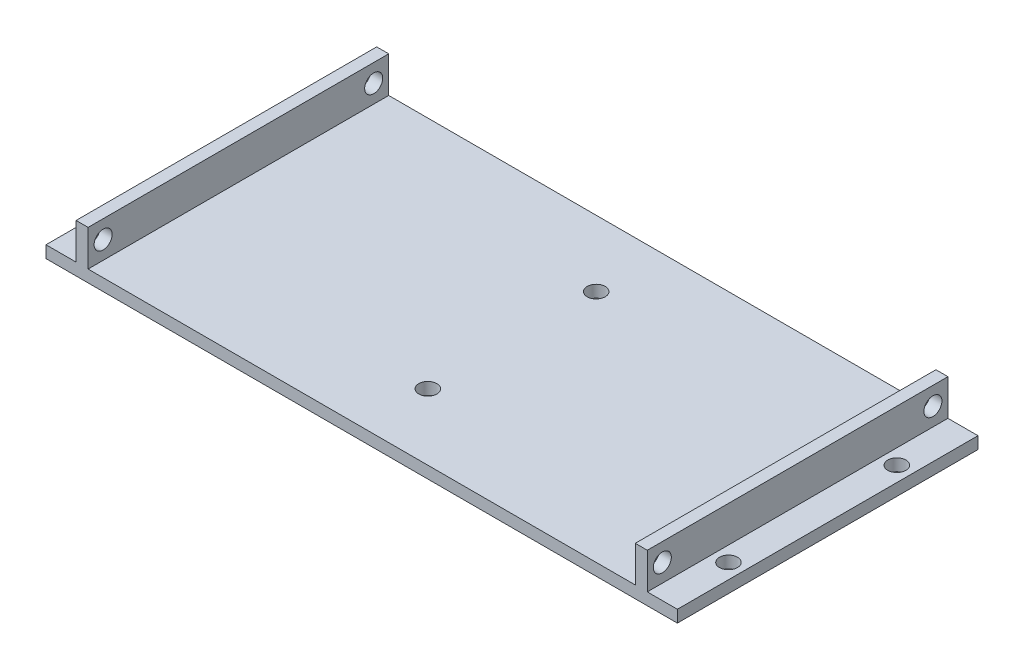
ISO-10303-21;
HEADER;
FILE_DESCRIPTION(('STEP AP214'),'2;1');
FILE_NAME('part.step','',(''),(''),'','','');
FILE_SCHEMA(('AUTOMOTIVE_DESIGN { 1 0 10303 214 1 1 1 1 }'));
ENDSEC;
DATA;
#1=APPLICATION_CONTEXT('core data for automotive mechanical design processes');
#2=APPLICATION_PROTOCOL_DEFINITION('international standard','automotive_design',2000,#1);
#3=PRODUCT_CONTEXT('',#1,'mechanical');
#4=PRODUCT('Part','Part','',(#3));
#5=PRODUCT_RELATED_PRODUCT_CATEGORY('part','',(#4));
#6=PRODUCT_DEFINITION_FORMATION('','',#4);
#7=PRODUCT_DEFINITION_CONTEXT('part definition',#1,'design');
#8=PRODUCT_DEFINITION('design','',#6,#7);
#9=PRODUCT_DEFINITION_SHAPE('','',#8);
#10=(LENGTH_UNIT() NAMED_UNIT(*) SI_UNIT(.MILLI.,.METRE.));
#11=(NAMED_UNIT(*) PLANE_ANGLE_UNIT() SI_UNIT($,.RADIAN.));
#12=(NAMED_UNIT(*) SI_UNIT($,.STERADIAN.) SOLID_ANGLE_UNIT());
#13=UNCERTAINTY_MEASURE_WITH_UNIT(LENGTH_MEASURE(1.E-05),#10,'distance_accuracy_value','');
#14=(GEOMETRIC_REPRESENTATION_CONTEXT(3) GLOBAL_UNCERTAINTY_ASSIGNED_CONTEXT((#13)) GLOBAL_UNIT_ASSIGNED_CONTEXT((#10,
#11,#12)) REPRESENTATION_CONTEXT('',''));
#15=CARTESIAN_POINT('',(0.,0.,0.));
#16=DIRECTION('',(0.,0.,1.));
#17=DIRECTION('',(1.,0.,0.));
#18=AXIS2_PLACEMENT_3D('',#15,#16,#17);
#19=CARTESIAN_POINT('',(0.,2.,0.));
#20=DIRECTION('',(0.,-1.,0.));
#21=DIRECTION('',(0.,0.,-1.));
#22=AXIS2_PLACEMENT_3D('',#19,#20,#21);
#23=PLANE('',#22);
#24=CARTESIAN_POINT('',(0.,2.,-14.));
#25=DIRECTION('',(0.,1.,0.));
#26=DIRECTION('',(0.,0.,1.));
#27=AXIS2_PLACEMENT_3D('',#24,#25,#26);
#28=CIRCLE('',#27,1.5);
#29=CARTESIAN_POINT('',(0.,2.,-12.5));
#30=VERTEX_POINT('',#29);
#31=EDGE_CURVE('E255',#30,#30,#28,.T.);
#32=ORIENTED_EDGE('',*,*,#31,.F.);
#33=EDGE_LOOP('',(#32));
#34=FACE_BOUND('',#33,.T.);
#35=CARTESIAN_POINT('',(0.,2.,14.));
#36=DIRECTION('',(0.,1.,0.));
#37=DIRECTION('',(0.,0.,1.));
#38=AXIS2_PLACEMENT_3D('',#35,#36,#37);
#39=CIRCLE('',#38,1.5);
#40=CARTESIAN_POINT('',(0.,2.,15.5));
#41=VERTEX_POINT('',#40);
#42=EDGE_CURVE('E252',#41,#41,#39,.T.);
#43=ORIENTED_EDGE('',*,*,#42,.F.);
#44=EDGE_LOOP('',(#43));
#45=FACE_BOUND('',#44,.T.);
#46=DIRECTION('',(0.,0.,1.));
#47=VECTOR('',#46,1.);
#48=CARTESIAN_POINT('',(45.5,2.,25.));
#49=LINE('',#48,#47);
#50=CARTESIAN_POINT('',(45.5,2.,-25.));
#51=VERTEX_POINT('',#50);
#52=CARTESIAN_POINT('',(45.5,2.,25.));
#53=VERTEX_POINT('',#52);
#54=EDGE_CURVE('E51',#51,#53,#49,.T.);
#55=ORIENTED_EDGE('',*,*,#54,.F.);
#56=DIRECTION('',(-1.,0.,0.));
#57=VECTOR('',#56,1.);
#58=CARTESIAN_POINT('',(-52.5,2.,-25.));
#59=LINE('',#58,#57);
#60=CARTESIAN_POINT('',(-45.5,2.,-25.));
#61=VERTEX_POINT('',#60);
#62=EDGE_CURVE('E188',#51,#61,#59,.T.);
#63=ORIENTED_EDGE('',*,*,#62,.T.);
#64=DIRECTION('',(0.,0.,-1.));
#65=VECTOR('',#64,1.);
#66=CARTESIAN_POINT('',(-45.5,2.,25.));
#67=LINE('',#66,#65);
#68=CARTESIAN_POINT('',(-45.5,2.,25.));
#69=VERTEX_POINT('',#68);
#70=EDGE_CURVE('E152',#69,#61,#67,.T.);
#71=ORIENTED_EDGE('',*,*,#70,.F.);
#72=DIRECTION('',(1.,0.,0.));
#73=VECTOR('',#72,1.);
#74=CARTESIAN_POINT('',(-52.5,2.,25.));
#75=LINE('',#74,#73);
#76=EDGE_CURVE('E194',#69,#53,#75,.T.);
#77=ORIENTED_EDGE('',*,*,#76,.T.);
#78=EDGE_LOOP('',(#55,#63,#71,#77));
#79=FACE_BOUND('',#78,.T.);
#80=ADVANCED_FACE('F34',(#34,#45,#79),#23,.F.);
#81=CARTESIAN_POINT('',(50.,2.,14.));
#82=DIRECTION('',(0.,1.,0.));
#83=DIRECTION('',(0.,0.,1.));
#84=AXIS2_PLACEMENT_3D('',#81,#82,#83);
#85=CIRCLE('',#84,1.5);
#86=CARTESIAN_POINT('',(50.,2.,15.5));
#87=VERTEX_POINT('',#86);
#88=EDGE_CURVE('E256',#87,#87,#85,.T.);
#89=ORIENTED_EDGE('',*,*,#88,.F.);
#90=EDGE_LOOP('',(#89));
#91=FACE_BOUND('',#90,.T.);
#92=CARTESIAN_POINT('',(50.,2.,-14.));
#93=DIRECTION('',(0.,1.,0.));
#94=DIRECTION('',(0.,0.,1.));
#95=AXIS2_PLACEMENT_3D('',#92,#93,#94);
#96=CIRCLE('',#95,1.5);
#97=CARTESIAN_POINT('',(50.,2.,-12.5));
#98=VERTEX_POINT('',#97);
#99=EDGE_CURVE('E259',#98,#98,#96,.T.);
#100=ORIENTED_EDGE('',*,*,#99,.F.);
#101=EDGE_LOOP('',(#100));
#102=FACE_BOUND('',#101,.T.);
#103=DIRECTION('',(0.,0.,-1.));
#104=VECTOR('',#103,1.);
#105=CARTESIAN_POINT('',(47.5,2.,25.));
#106=LINE('',#105,#104);
#107=CARTESIAN_POINT('',(47.5,2.,25.));
#108=VERTEX_POINT('',#107);
#109=CARTESIAN_POINT('',(47.5,2.,-25.));
#110=VERTEX_POINT('',#109);
#111=EDGE_CURVE('E146',#108,#110,#106,.T.);
#112=ORIENTED_EDGE('',*,*,#111,.F.);
#113=CARTESIAN_POINT('',(52.5,2.,25.));
#114=VERTEX_POINT('',#113);
#115=EDGE_CURVE('E190',#108,#114,#75,.T.);
#116=ORIENTED_EDGE('',*,*,#115,.T.);
#117=DIRECTION('',(0.,0.,-1.));
#118=VECTOR('',#117,1.);
#119=CARTESIAN_POINT('',(52.5,2.,25.));
#120=LINE('',#119,#118);
#121=CARTESIAN_POINT('',(52.5,2.,-25.));
#122=VERTEX_POINT('',#121);
#123=EDGE_CURVE('E182',#114,#122,#120,.T.);
#124=ORIENTED_EDGE('',*,*,#123,.T.);
#125=EDGE_CURVE('E59',#122,#110,#59,.T.);
#126=ORIENTED_EDGE('',*,*,#125,.T.);
#127=EDGE_LOOP('',(#112,#116,#124,#126));
#128=FACE_BOUND('',#127,.T.);
#129=ADVANCED_FACE('F280',(#91,#102,#128),#23,.F.);
#130=CARTESIAN_POINT('',(-50.,2.,14.));
#131=DIRECTION('',(0.,1.,0.));
#132=DIRECTION('',(0.,0.,1.));
#133=AXIS2_PLACEMENT_3D('',#130,#131,#132);
#134=CIRCLE('',#133,1.5);
#135=CARTESIAN_POINT('',(-50.,2.,15.5));
#136=VERTEX_POINT('',#135);
#137=EDGE_CURVE('E262',#136,#136,#134,.T.);
#138=ORIENTED_EDGE('',*,*,#137,.F.);
#139=EDGE_LOOP('',(#138));
#140=FACE_BOUND('',#139,.T.);
#141=CARTESIAN_POINT('',(-50.,2.,-14.));
#142=DIRECTION('',(0.,1.,0.));
#143=DIRECTION('',(0.,0.,1.));
#144=AXIS2_PLACEMENT_3D('',#141,#142,#143);
#145=CIRCLE('',#144,1.5);
#146=CARTESIAN_POINT('',(-50.,2.,-12.5));
#147=VERTEX_POINT('',#146);
#148=EDGE_CURVE('E213',#147,#147,#145,.T.);
#149=ORIENTED_EDGE('',*,*,#148,.F.);
#150=EDGE_LOOP('',(#149));
#151=FACE_BOUND('',#150,.T.);
#152=DIRECTION('',(0.,0.,1.));
#153=VECTOR('',#152,1.);
#154=CARTESIAN_POINT('',(-47.5,2.,25.));
#155=LINE('',#154,#153);
#156=CARTESIAN_POINT('',(-47.5,2.,-25.));
#157=VERTEX_POINT('',#156);
#158=CARTESIAN_POINT('',(-47.5,2.,25.));
#159=VERTEX_POINT('',#158);
#160=EDGE_CURVE('E149',#157,#159,#155,.T.);
#161=ORIENTED_EDGE('',*,*,#160,.F.);
#162=CARTESIAN_POINT('',(-52.5,2.,-25.));
#163=VERTEX_POINT('',#162);
#164=EDGE_CURVE('E184',#157,#163,#59,.T.);
#165=ORIENTED_EDGE('',*,*,#164,.T.);
#166=DIRECTION('',(0.,0.,1.));
#167=VECTOR('',#166,1.);
#168=CARTESIAN_POINT('',(-52.5,2.,25.));
#169=LINE('',#168,#167);
#170=CARTESIAN_POINT('',(-52.5,2.,25.));
#171=VERTEX_POINT('',#170);
#172=EDGE_CURVE('E187',#163,#171,#169,.T.);
#173=ORIENTED_EDGE('',*,*,#172,.T.);
#174=EDGE_CURVE('E191',#171,#159,#75,.T.);
#175=ORIENTED_EDGE('',*,*,#174,.T.);
#176=EDGE_LOOP('',(#161,#165,#173,#175));
#177=FACE_BOUND('',#176,.T.);
#178=ADVANCED_FACE('F314',(#140,#151,#177),#23,.F.);
#179=CARTESIAN_POINT('',(52.5,2.,25.));
#180=DIRECTION('',(-1.,0.,0.));
#181=DIRECTION('',(0.,0.,1.));
#182=AXIS2_PLACEMENT_3D('',#179,#180,#181);
#183=PLANE('',#182);
#184=DIRECTION('',(0.,0.,-1.));
#185=VECTOR('',#184,1.);
#186=CARTESIAN_POINT('',(52.5,0.,25.));
#187=LINE('',#186,#185);
#188=CARTESIAN_POINT('',(52.5,0.,25.));
#189=VERTEX_POINT('',#188);
#190=CARTESIAN_POINT('',(52.5,0.,-25.));
#191=VERTEX_POINT('',#190);
#192=EDGE_CURVE('E181',#189,#191,#187,.T.);
#193=ORIENTED_EDGE('',*,*,#192,.T.);
#194=DIRECTION('',(0.,-1.,0.));
#195=VECTOR('',#194,1.);
#196=CARTESIAN_POINT('',(52.5,2.,-25.));
#197=LINE('',#196,#195);
#198=EDGE_CURVE('E11',#122,#191,#197,.T.);
#199=ORIENTED_EDGE('',*,*,#198,.F.);
#200=ORIENTED_EDGE('',*,*,#123,.F.);
#201=DIRECTION('',(0.,-1.,0.));
#202=VECTOR('',#201,1.);
#203=CARTESIAN_POINT('',(52.5,2.,25.));
#204=LINE('',#203,#202);
#205=EDGE_CURVE('E193',#114,#189,#204,.T.);
#206=ORIENTED_EDGE('',*,*,#205,.T.);
#207=EDGE_LOOP('',(#193,#199,#200,#206));
#208=FACE_BOUND('',#207,.T.);
#209=ADVANCED_FACE('F36',(#208),#183,.F.);
#210=CARTESIAN_POINT('',(-52.5,2.,-25.));
#211=DIRECTION('',(0.,0.,1.));
#212=DIRECTION('',(1.,0.,0.));
#213=AXIS2_PLACEMENT_3D('',#210,#211,#212);
#214=PLANE('',#213);
#215=DIRECTION('',(-1.,0.,0.));
#216=VECTOR('',#215,1.);
#217=CARTESIAN_POINT('',(-52.5,0.,-25.));
#218=LINE('',#217,#216);
#219=CARTESIAN_POINT('',(-52.5,0.,-25.));
#220=VERTEX_POINT('',#219);
#221=EDGE_CURVE('E197',#191,#220,#218,.T.);
#222=ORIENTED_EDGE('',*,*,#221,.T.);
#223=DIRECTION('',(0.,-1.,0.));
#224=VECTOR('',#223,1.);
#225=CARTESIAN_POINT('',(-52.5,2.,-25.));
#226=LINE('',#225,#224);
#227=EDGE_CURVE('E43',#163,#220,#226,.T.);
#228=ORIENTED_EDGE('',*,*,#227,.F.);
#229=ORIENTED_EDGE('',*,*,#164,.F.);
#230=DIRECTION('',(0.,-1.,0.));
#231=VECTOR('',#230,1.);
#232=CARTESIAN_POINT('',(-47.5,8.,-25.));
#233=LINE('',#232,#231);
#234=CARTESIAN_POINT('',(-47.5,8.,-25.));
#235=VERTEX_POINT('',#234);
#236=EDGE_CURVE('E166',#235,#157,#233,.T.);
#237=ORIENTED_EDGE('',*,*,#236,.F.);
#238=DIRECTION('',(-1.,0.,0.));
#239=VECTOR('',#238,1.);
#240=CARTESIAN_POINT('',(-45.5,8.,-25.));
#241=LINE('',#240,#239);
#242=CARTESIAN_POINT('',(-45.5,8.,-25.));
#243=VERTEX_POINT('',#242);
#244=EDGE_CURVE('E165',#243,#235,#241,.T.);
#245=ORIENTED_EDGE('',*,*,#244,.F.);
#246=DIRECTION('',(0.,-1.,0.));
#247=VECTOR('',#246,1.);
#248=CARTESIAN_POINT('',(-45.5,8.,-25.));
#249=LINE('',#248,#247);
#250=EDGE_CURVE('E172',#243,#61,#249,.T.);
#251=ORIENTED_EDGE('',*,*,#250,.T.);
#252=ORIENTED_EDGE('',*,*,#62,.F.);
#253=DIRECTION('',(0.,-1.,0.));
#254=VECTOR('',#253,1.);
#255=CARTESIAN_POINT('',(45.5,8.,-25.));
#256=LINE('',#255,#254);
#257=CARTESIAN_POINT('',(45.5,8.,-25.));
#258=VERTEX_POINT('',#257);
#259=EDGE_CURVE('E271',#258,#51,#256,.T.);
#260=ORIENTED_EDGE('',*,*,#259,.F.);
#261=DIRECTION('',(-1.,0.,0.));
#262=VECTOR('',#261,1.);
#263=CARTESIAN_POINT('',(47.5,8.,-25.));
#264=LINE('',#263,#262);
#265=CARTESIAN_POINT('',(47.5,8.,-25.));
#266=VERTEX_POINT('',#265);
#267=EDGE_CURVE('E142',#266,#258,#264,.T.);
#268=ORIENTED_EDGE('',*,*,#267,.F.);
#269=DIRECTION('',(0.,-1.,0.));
#270=VECTOR('',#269,1.);
#271=CARTESIAN_POINT('',(47.5,8.,-25.));
#272=LINE('',#271,#270);
#273=EDGE_CURVE('E154',#266,#110,#272,.T.);
#274=ORIENTED_EDGE('',*,*,#273,.T.);
#275=ORIENTED_EDGE('',*,*,#125,.F.);
#276=ORIENTED_EDGE('',*,*,#198,.T.);
#277=EDGE_LOOP('',(#222,#228,#229,#237,#245,#251,#252,#260,#268,#274,#275,#276));
#278=FACE_BOUND('',#277,.T.);
#279=ADVANCED_FACE('F277',(#278),#214,.F.);
#280=CARTESIAN_POINT('',(-52.5,2.,25.));
#281=DIRECTION('',(1.,0.,0.));
#282=DIRECTION('',(0.,0.,-1.));
#283=AXIS2_PLACEMENT_3D('',#280,#281,#282);
#284=PLANE('',#283);
#285=DIRECTION('',(0.,0.,1.));
#286=VECTOR('',#285,1.);
#287=CARTESIAN_POINT('',(-52.5,0.,25.));
#288=LINE('',#287,#286);
#289=CARTESIAN_POINT('',(-52.5,0.,25.));
#290=VERTEX_POINT('',#289);
#291=EDGE_CURVE('E199',#220,#290,#288,.T.);
#292=ORIENTED_EDGE('',*,*,#291,.T.);
#293=DIRECTION('',(0.,-1.,0.));
#294=VECTOR('',#293,1.);
#295=CARTESIAN_POINT('',(-52.5,2.,25.));
#296=LINE('',#295,#294);
#297=EDGE_CURVE('E204',#171,#290,#296,.T.);
#298=ORIENTED_EDGE('',*,*,#297,.F.);
#299=ORIENTED_EDGE('',*,*,#172,.F.);
#300=ORIENTED_EDGE('',*,*,#227,.T.);
#301=EDGE_LOOP('',(#292,#298,#299,#300));
#302=FACE_BOUND('',#301,.T.);
#303=ADVANCED_FACE('F293',(#302),#284,.F.);
#304=CARTESIAN_POINT('',(-52.5,2.,25.));
#305=DIRECTION('',(0.,0.,-1.));
#306=DIRECTION('',(-1.,0.,0.));
#307=AXIS2_PLACEMENT_3D('',#304,#305,#306);
#308=PLANE('',#307);
#309=DIRECTION('',(1.,0.,0.));
#310=VECTOR('',#309,1.);
#311=CARTESIAN_POINT('',(-52.5,0.,25.));
#312=LINE('',#311,#310);
#313=EDGE_CURVE('E185',#290,#189,#312,.T.);
#314=ORIENTED_EDGE('',*,*,#313,.T.);
#315=ORIENTED_EDGE('',*,*,#205,.F.);
#316=ORIENTED_EDGE('',*,*,#115,.F.);
#317=DIRECTION('',(0.,-1.,0.));
#318=VECTOR('',#317,1.);
#319=CARTESIAN_POINT('',(47.5,8.,25.));
#320=LINE('',#319,#318);
#321=CARTESIAN_POINT('',(47.5,8.,25.));
#322=VERTEX_POINT('',#321);
#323=EDGE_CURVE('E133',#322,#108,#320,.T.);
#324=ORIENTED_EDGE('',*,*,#323,.F.);
#325=DIRECTION('',(1.,0.,0.));
#326=VECTOR('',#325,1.);
#327=CARTESIAN_POINT('',(47.5,8.,25.));
#328=LINE('',#327,#326);
#329=CARTESIAN_POINT('',(45.5,8.,25.));
#330=VERTEX_POINT('',#329);
#331=EDGE_CURVE('E126',#330,#322,#328,.T.);
#332=ORIENTED_EDGE('',*,*,#331,.F.);
#333=DIRECTION('',(0.,-1.,0.));
#334=VECTOR('',#333,1.);
#335=CARTESIAN_POINT('',(45.5,8.,25.));
#336=LINE('',#335,#334);
#337=EDGE_CURVE('E131',#330,#53,#336,.T.);
#338=ORIENTED_EDGE('',*,*,#337,.T.);
#339=ORIENTED_EDGE('',*,*,#76,.F.);
#340=DIRECTION('',(0.,-1.,0.));
#341=VECTOR('',#340,1.);
#342=CARTESIAN_POINT('',(-45.5,8.,25.));
#343=LINE('',#342,#341);
#344=CARTESIAN_POINT('',(-45.5,8.,25.));
#345=VERTEX_POINT('',#344);
#346=EDGE_CURVE('E175',#345,#69,#343,.T.);
#347=ORIENTED_EDGE('',*,*,#346,.F.);
#348=DIRECTION('',(1.,0.,0.));
#349=VECTOR('',#348,1.);
#350=CARTESIAN_POINT('',(-45.5,8.,25.));
#351=LINE('',#350,#349);
#352=CARTESIAN_POINT('',(-47.5,8.,25.));
#353=VERTEX_POINT('',#352);
#354=EDGE_CURVE('E161',#353,#345,#351,.T.);
#355=ORIENTED_EDGE('',*,*,#354,.F.);
#356=DIRECTION('',(0.,-1.,0.));
#357=VECTOR('',#356,1.);
#358=CARTESIAN_POINT('',(-47.5,8.,25.));
#359=LINE('',#358,#357);
#360=EDGE_CURVE('E178',#353,#159,#359,.T.);
#361=ORIENTED_EDGE('',*,*,#360,.T.);
#362=ORIENTED_EDGE('',*,*,#174,.F.);
#363=ORIENTED_EDGE('',*,*,#297,.T.);
#364=EDGE_LOOP('',(#314,#315,#316,#324,#332,#338,#339,#347,#355,#361,#362,#363));
#365=FACE_BOUND('',#364,.T.);
#366=ADVANCED_FACE('F128',(#365),#308,.F.);
#367=CARTESIAN_POINT('',(0.,0.,0.));
#368=DIRECTION('',(0.,-1.,0.));
#369=DIRECTION('',(0.,0.,-1.));
#370=AXIS2_PLACEMENT_3D('',#367,#368,#369);
#371=PLANE('',#370);
#372=CARTESIAN_POINT('',(0.,0.,-14.));
#373=DIRECTION('',(0.,-1.,0.));
#374=DIRECTION('',(0.,0.,-1.));
#375=AXIS2_PLACEMENT_3D('',#372,#373,#374);
#376=CIRCLE('',#375,1.5);
#377=CARTESIAN_POINT('',(0.,0.,-15.5));
#378=VERTEX_POINT('',#377);
#379=EDGE_CURVE('E225',#378,#378,#376,.T.);
#380=ORIENTED_EDGE('',*,*,#379,.F.);
#381=EDGE_LOOP('',(#380));
#382=FACE_BOUND('',#381,.T.);
#383=CARTESIAN_POINT('',(50.,0.,14.));
#384=DIRECTION('',(0.,-1.,0.));
#385=DIRECTION('',(0.,0.,-1.));
#386=AXIS2_PLACEMENT_3D('',#383,#384,#385);
#387=CIRCLE('',#386,1.5);
#388=CARTESIAN_POINT('',(50.,0.,12.5));
#389=VERTEX_POINT('',#388);
#390=EDGE_CURVE('E222',#389,#389,#387,.T.);
#391=ORIENTED_EDGE('',*,*,#390,.F.);
#392=EDGE_LOOP('',(#391));
#393=FACE_BOUND('',#392,.T.);
#394=CARTESIAN_POINT('',(50.,0.,-14.));
#395=DIRECTION('',(0.,-1.,0.));
#396=DIRECTION('',(0.,0.,-1.));
#397=AXIS2_PLACEMENT_3D('',#394,#395,#396);
#398=CIRCLE('',#397,1.5);
#399=CARTESIAN_POINT('',(50.,0.,-15.5));
#400=VERTEX_POINT('',#399);
#401=EDGE_CURVE('E219',#400,#400,#398,.T.);
#402=ORIENTED_EDGE('',*,*,#401,.F.);
#403=EDGE_LOOP('',(#402));
#404=FACE_BOUND('',#403,.T.);
#405=CARTESIAN_POINT('',(-50.,0.,14.));
#406=DIRECTION('',(0.,-1.,0.));
#407=DIRECTION('',(0.,0.,-1.));
#408=AXIS2_PLACEMENT_3D('',#405,#406,#407);
#409=CIRCLE('',#408,1.5);
#410=CARTESIAN_POINT('',(-50.,0.,12.5));
#411=VERTEX_POINT('',#410);
#412=EDGE_CURVE('E216',#411,#411,#409,.T.);
#413=ORIENTED_EDGE('',*,*,#412,.F.);
#414=EDGE_LOOP('',(#413));
#415=FACE_BOUND('',#414,.T.);
#416=CARTESIAN_POINT('',(0.,0.,14.));
#417=DIRECTION('',(0.,-1.,0.));
#418=DIRECTION('',(0.,0.,-1.));
#419=AXIS2_PLACEMENT_3D('',#416,#417,#418);
#420=CIRCLE('',#419,1.5);
#421=CARTESIAN_POINT('',(0.,0.,12.5));
#422=VERTEX_POINT('',#421);
#423=EDGE_CURVE('E212',#422,#422,#420,.T.);
#424=ORIENTED_EDGE('',*,*,#423,.F.);
#425=EDGE_LOOP('',(#424));
#426=FACE_BOUND('',#425,.T.);
#427=CARTESIAN_POINT('',(-50.,0.,-14.));
#428=DIRECTION('',(0.,-1.,0.));
#429=DIRECTION('',(0.,0.,-1.));
#430=AXIS2_PLACEMENT_3D('',#427,#428,#429);
#431=CIRCLE('',#430,1.5);
#432=CARTESIAN_POINT('',(-50.,0.,-15.5));
#433=VERTEX_POINT('',#432);
#434=EDGE_CURVE('E209',#433,#433,#431,.T.);
#435=ORIENTED_EDGE('',*,*,#434,.F.);
#436=EDGE_LOOP('',(#435));
#437=FACE_BOUND('',#436,.T.);
#438=ORIENTED_EDGE('',*,*,#192,.F.);
#439=ORIENTED_EDGE('',*,*,#313,.F.);
#440=ORIENTED_EDGE('',*,*,#291,.F.);
#441=ORIENTED_EDGE('',*,*,#221,.F.);
#442=EDGE_LOOP('',(#438,#439,#440,#441));
#443=FACE_BOUND('',#442,.T.);
#444=ADVANCED_FACE('F295',(#382,#393,#404,#415,#426,#437,#443),#371,.T.);
#445=CARTESIAN_POINT('',(-47.5,8.,25.));
#446=DIRECTION('',(1.,0.,0.));
#447=DIRECTION('',(0.,0.,-1.));
#448=AXIS2_PLACEMENT_3D('',#445,#446,#447);
#449=PLANE('',#448);
#450=CARTESIAN_POINT('',(-47.5,5.,22.5));
#451=DIRECTION('',(-1.,0.,0.));
#452=DIRECTION('',(0.,0.,1.));
#453=AXIS2_PLACEMENT_3D('',#450,#451,#452);
#454=CIRCLE('',#453,1.5);
#455=CARTESIAN_POINT('',(-47.5,5.,24.));
#456=VERTEX_POINT('',#455);
#457=EDGE_CURVE('E230',#456,#456,#454,.T.);
#458=ORIENTED_EDGE('',*,*,#457,.F.);
#459=EDGE_LOOP('',(#458));
#460=FACE_BOUND('',#459,.T.);
#461=CARTESIAN_POINT('',(-47.5,5.,-22.5));
#462=DIRECTION('',(-1.,0.,0.));
#463=DIRECTION('',(0.,0.,1.));
#464=AXIS2_PLACEMENT_3D('',#461,#462,#463);
#465=CIRCLE('',#464,1.5);
#466=CARTESIAN_POINT('',(-47.5,5.,-21.));
#467=VERTEX_POINT('',#466);
#468=EDGE_CURVE('E237',#467,#467,#465,.T.);
#469=ORIENTED_EDGE('',*,*,#468,.F.);
#470=EDGE_LOOP('',(#469));
#471=FACE_BOUND('',#470,.T.);
#472=ORIENTED_EDGE('',*,*,#160,.T.);
#473=ORIENTED_EDGE('',*,*,#360,.F.);
#474=DIRECTION('',(0.,0.,1.));
#475=VECTOR('',#474,1.);
#476=CARTESIAN_POINT('',(-47.5,8.,25.));
#477=LINE('',#476,#475);
#478=EDGE_CURVE('E158',#235,#353,#477,.T.);
#479=ORIENTED_EDGE('',*,*,#478,.F.);
#480=ORIENTED_EDGE('',*,*,#236,.T.);
#481=EDGE_LOOP('',(#472,#473,#479,#480));
#482=FACE_BOUND('',#481,.T.);
#483=ADVANCED_FACE('F297',(#460,#471,#482),#449,.F.);
#484=CARTESIAN_POINT('',(-45.5,8.,25.));
#485=DIRECTION('',(-1.,0.,0.));
#486=DIRECTION('',(0.,0.,1.));
#487=AXIS2_PLACEMENT_3D('',#484,#485,#486);
#488=PLANE('',#487);
#489=CARTESIAN_POINT('',(-45.5,5.,22.5));
#490=DIRECTION('',(-1.,0.,0.));
#491=DIRECTION('',(0.,0.,1.));
#492=AXIS2_PLACEMENT_3D('',#489,#490,#491);
#493=CIRCLE('',#492,1.5);
#494=CARTESIAN_POINT('',(-45.5,5.,24.));
#495=VERTEX_POINT('',#494);
#496=EDGE_CURVE('E249',#495,#495,#493,.T.);
#497=ORIENTED_EDGE('',*,*,#496,.T.);
#498=EDGE_LOOP('',(#497));
#499=FACE_BOUND('',#498,.T.);
#500=CARTESIAN_POINT('',(-45.5,5.,-22.5));
#501=DIRECTION('',(-1.,0.,0.));
#502=DIRECTION('',(0.,0.,1.));
#503=AXIS2_PLACEMENT_3D('',#500,#501,#502);
#504=CIRCLE('',#503,1.5);
#505=CARTESIAN_POINT('',(-45.5,5.,-21.));
#506=VERTEX_POINT('',#505);
#507=EDGE_CURVE('E234',#506,#506,#504,.T.);
#508=ORIENTED_EDGE('',*,*,#507,.T.);
#509=EDGE_LOOP('',(#508));
#510=FACE_BOUND('',#509,.T.);
#511=ORIENTED_EDGE('',*,*,#70,.T.);
#512=ORIENTED_EDGE('',*,*,#250,.F.);
#513=DIRECTION('',(0.,0.,-1.));
#514=VECTOR('',#513,1.);
#515=CARTESIAN_POINT('',(-45.5,8.,25.));
#516=LINE('',#515,#514);
#517=EDGE_CURVE('E163',#345,#243,#516,.T.);
#518=ORIENTED_EDGE('',*,*,#517,.F.);
#519=ORIENTED_EDGE('',*,*,#346,.T.);
#520=EDGE_LOOP('',(#511,#512,#518,#519));
#521=FACE_BOUND('',#520,.T.);
#522=ADVANCED_FACE('F305',(#499,#510,#521),#488,.F.);
#523=CARTESIAN_POINT('',(0.,8.,0.));
#524=DIRECTION('',(0.,1.,0.));
#525=DIRECTION('',(0.,0.,1.));
#526=AXIS2_PLACEMENT_3D('',#523,#524,#525);
#527=PLANE('',#526);
#528=ORIENTED_EDGE('',*,*,#478,.T.);
#529=ORIENTED_EDGE('',*,*,#354,.T.);
#530=ORIENTED_EDGE('',*,*,#517,.T.);
#531=ORIENTED_EDGE('',*,*,#244,.T.);
#532=EDGE_LOOP('',(#528,#529,#530,#531));
#533=FACE_BOUND('',#532,.T.);
#534=ADVANCED_FACE('F337',(#533),#527,.T.);
#535=CARTESIAN_POINT('',(45.5,8.,25.));
#536=DIRECTION('',(1.,0.,0.));
#537=DIRECTION('',(0.,0.,-1.));
#538=AXIS2_PLACEMENT_3D('',#535,#536,#537);
#539=PLANE('',#538);
#540=CARTESIAN_POINT('',(45.5,5.,22.5));
#541=DIRECTION('',(1.,0.,0.));
#542=DIRECTION('',(0.,0.,-1.));
#543=AXIS2_PLACEMENT_3D('',#540,#541,#542);
#544=CIRCLE('',#543,1.5);
#545=CARTESIAN_POINT('',(45.5,5.,21.));
#546=VERTEX_POINT('',#545);
#547=EDGE_CURVE('E246',#546,#546,#544,.T.);
#548=ORIENTED_EDGE('',*,*,#547,.T.);
#549=EDGE_LOOP('',(#548));
#550=FACE_BOUND('',#549,.T.);
#551=CARTESIAN_POINT('',(45.5,5.,-22.5));
#552=DIRECTION('',(1.,0.,0.));
#553=DIRECTION('',(0.,0.,-1.));
#554=AXIS2_PLACEMENT_3D('',#551,#552,#553);
#555=CIRCLE('',#554,1.5);
#556=CARTESIAN_POINT('',(45.5,5.,-24.));
#557=VERTEX_POINT('',#556);
#558=EDGE_CURVE('E229',#557,#557,#555,.T.);
#559=ORIENTED_EDGE('',*,*,#558,.T.);
#560=EDGE_LOOP('',(#559));
#561=FACE_BOUND('',#560,.T.);
#562=ORIENTED_EDGE('',*,*,#54,.T.);
#563=ORIENTED_EDGE('',*,*,#337,.F.);
#564=DIRECTION('',(0.,0.,1.));
#565=VECTOR('',#564,1.);
#566=CARTESIAN_POINT('',(45.5,8.,25.));
#567=LINE('',#566,#565);
#568=EDGE_CURVE('E137',#258,#330,#567,.T.);
#569=ORIENTED_EDGE('',*,*,#568,.F.);
#570=ORIENTED_EDGE('',*,*,#259,.T.);
#571=EDGE_LOOP('',(#562,#563,#569,#570));
#572=FACE_BOUND('',#571,.T.);
#573=ADVANCED_FACE('F148',(#550,#561,#572),#539,.F.);
#574=CARTESIAN_POINT('',(47.5,8.,25.));
#575=DIRECTION('',(-1.,0.,0.));
#576=DIRECTION('',(0.,0.,1.));
#577=AXIS2_PLACEMENT_3D('',#574,#575,#576);
#578=PLANE('',#577);
#579=CARTESIAN_POINT('',(47.5,5.,22.5));
#580=DIRECTION('',(-1.,0.,0.));
#581=DIRECTION('',(0.,0.,1.));
#582=AXIS2_PLACEMENT_3D('',#579,#580,#581);
#583=CIRCLE('',#582,1.5);
#584=CARTESIAN_POINT('',(47.5,5.,24.));
#585=VERTEX_POINT('',#584);
#586=EDGE_CURVE('E38',#585,#585,#583,.T.);
#587=ORIENTED_EDGE('',*,*,#586,.T.);
#588=EDGE_LOOP('',(#587));
#589=FACE_BOUND('',#588,.T.);
#590=CARTESIAN_POINT('',(47.5,5.,-22.5));
#591=DIRECTION('',(-1.,0.,0.));
#592=DIRECTION('',(0.,0.,1.));
#593=AXIS2_PLACEMENT_3D('',#590,#591,#592);
#594=CIRCLE('',#593,1.5);
#595=CARTESIAN_POINT('',(47.5,5.,-21.));
#596=VERTEX_POINT('',#595);
#597=EDGE_CURVE('E227',#596,#596,#594,.T.);
#598=ORIENTED_EDGE('',*,*,#597,.T.);
#599=EDGE_LOOP('',(#598));
#600=FACE_BOUND('',#599,.T.);
#601=ORIENTED_EDGE('',*,*,#111,.T.);
#602=ORIENTED_EDGE('',*,*,#273,.F.);
#603=DIRECTION('',(0.,0.,-1.));
#604=VECTOR('',#603,1.);
#605=CARTESIAN_POINT('',(47.5,8.,25.));
#606=LINE('',#605,#604);
#607=EDGE_CURVE('E136',#322,#266,#606,.T.);
#608=ORIENTED_EDGE('',*,*,#607,.F.);
#609=ORIENTED_EDGE('',*,*,#323,.T.);
#610=EDGE_LOOP('',(#601,#602,#608,#609));
#611=FACE_BOUND('',#610,.T.);
#612=ADVANCED_FACE('F279',(#589,#600,#611),#578,.F.);
#613=CARTESIAN_POINT('',(0.,8.,0.));
#614=DIRECTION('',(0.,1.,0.));
#615=DIRECTION('',(0.,0.,1.));
#616=AXIS2_PLACEMENT_3D('',#613,#614,#615);
#617=PLANE('',#616);
#618=ORIENTED_EDGE('',*,*,#568,.T.);
#619=ORIENTED_EDGE('',*,*,#331,.T.);
#620=ORIENTED_EDGE('',*,*,#607,.T.);
#621=ORIENTED_EDGE('',*,*,#267,.T.);
#622=EDGE_LOOP('',(#618,#619,#620,#621));
#623=FACE_BOUND('',#622,.T.);
#624=ADVANCED_FACE('F140',(#623),#617,.T.);
#625=CARTESIAN_POINT('',(-50.,-4.,-14.));
#626=DIRECTION('',(0.,1.,0.));
#627=DIRECTION('',(0.,0.,1.));
#628=AXIS2_PLACEMENT_3D('',#625,#626,#627);
#629=CYLINDRICAL_SURFACE('',#628,1.5);
#630=ORIENTED_EDGE('',*,*,#434,.T.);
#631=EDGE_LOOP('',(#630));
#632=FACE_BOUND('',#631,.T.);
#633=ORIENTED_EDGE('',*,*,#148,.T.);
#634=EDGE_LOOP('',(#633));
#635=FACE_BOUND('',#634,.T.);
#636=ADVANCED_FACE('F359',(#632,#635),#629,.F.);
#637=CARTESIAN_POINT('',(0.,-4.,14.));
#638=DIRECTION('',(0.,1.,0.));
#639=DIRECTION('',(0.,0.,1.));
#640=AXIS2_PLACEMENT_3D('',#637,#638,#639);
#641=CYLINDRICAL_SURFACE('',#640,1.5);
#642=ORIENTED_EDGE('',*,*,#423,.T.);
#643=EDGE_LOOP('',(#642));
#644=FACE_BOUND('',#643,.T.);
#645=ORIENTED_EDGE('',*,*,#42,.T.);
#646=EDGE_LOOP('',(#645));
#647=FACE_BOUND('',#646,.T.);
#648=ADVANCED_FACE('F362',(#644,#647),#641,.F.);
#649=CARTESIAN_POINT('',(-50.,-4.,14.));
#650=DIRECTION('',(0.,1.,0.));
#651=DIRECTION('',(0.,0.,1.));
#652=AXIS2_PLACEMENT_3D('',#649,#650,#651);
#653=CYLINDRICAL_SURFACE('',#652,1.5);
#654=ORIENTED_EDGE('',*,*,#412,.T.);
#655=EDGE_LOOP('',(#654));
#656=FACE_BOUND('',#655,.T.);
#657=ORIENTED_EDGE('',*,*,#137,.T.);
#658=EDGE_LOOP('',(#657));
#659=FACE_BOUND('',#658,.T.);
#660=ADVANCED_FACE('F368',(#656,#659),#653,.F.);
#661=CARTESIAN_POINT('',(50.,-4.,-14.));
#662=DIRECTION('',(0.,1.,0.));
#663=DIRECTION('',(0.,0.,1.));
#664=AXIS2_PLACEMENT_3D('',#661,#662,#663);
#665=CYLINDRICAL_SURFACE('',#664,1.5);
#666=ORIENTED_EDGE('',*,*,#401,.T.);
#667=EDGE_LOOP('',(#666));
#668=FACE_BOUND('',#667,.T.);
#669=ORIENTED_EDGE('',*,*,#99,.T.);
#670=EDGE_LOOP('',(#669));
#671=FACE_BOUND('',#670,.T.);
#672=ADVANCED_FACE('F364',(#668,#671),#665,.F.);
#673=CARTESIAN_POINT('',(50.,-4.,14.));
#674=DIRECTION('',(0.,1.,0.));
#675=DIRECTION('',(0.,0.,1.));
#676=AXIS2_PLACEMENT_3D('',#673,#674,#675);
#677=CYLINDRICAL_SURFACE('',#676,1.5);
#678=ORIENTED_EDGE('',*,*,#390,.T.);
#679=EDGE_LOOP('',(#678));
#680=FACE_BOUND('',#679,.T.);
#681=ORIENTED_EDGE('',*,*,#88,.T.);
#682=EDGE_LOOP('',(#681));
#683=FACE_BOUND('',#682,.T.);
#684=ADVANCED_FACE('F367',(#680,#683),#677,.F.);
#685=CARTESIAN_POINT('',(0.,-4.,-14.));
#686=DIRECTION('',(0.,1.,0.));
#687=DIRECTION('',(0.,0.,1.));
#688=AXIS2_PLACEMENT_3D('',#685,#686,#687);
#689=CYLINDRICAL_SURFACE('',#688,1.5);
#690=ORIENTED_EDGE('',*,*,#379,.T.);
#691=EDGE_LOOP('',(#690));
#692=FACE_BOUND('',#691,.T.);
#693=ORIENTED_EDGE('',*,*,#31,.T.);
#694=EDGE_LOOP('',(#693));
#695=FACE_BOUND('',#694,.T.);
#696=ADVANCED_FACE('F373',(#692,#695),#689,.F.);
#697=CARTESIAN_POINT('',(52.5,5.,-22.5));
#698=DIRECTION('',(-1.,0.,0.));
#699=DIRECTION('',(0.,0.,1.));
#700=AXIS2_PLACEMENT_3D('',#697,#698,#699);
#701=CYLINDRICAL_SURFACE('',#700,1.5);
#702=ORIENTED_EDGE('',*,*,#597,.F.);
#703=EDGE_LOOP('',(#702));
#704=FACE_BOUND('',#703,.T.);
#705=ORIENTED_EDGE('',*,*,#558,.F.);
#706=EDGE_LOOP('',(#705));
#707=FACE_BOUND('',#706,.T.);
#708=ADVANCED_FACE('F376',(#704,#707),#701,.F.);
#709=CARTESIAN_POINT('',(52.5,5.,22.5));
#710=DIRECTION('',(-1.,0.,0.));
#711=DIRECTION('',(0.,0.,1.));
#712=AXIS2_PLACEMENT_3D('',#709,#710,#711);
#713=CYLINDRICAL_SURFACE('',#712,1.5);
#714=ORIENTED_EDGE('',*,*,#586,.F.);
#715=EDGE_LOOP('',(#714));
#716=FACE_BOUND('',#715,.T.);
#717=ORIENTED_EDGE('',*,*,#547,.F.);
#718=EDGE_LOOP('',(#717));
#719=FACE_BOUND('',#718,.T.);
#720=ADVANCED_FACE('F388',(#716,#719),#713,.F.);
#721=ORIENTED_EDGE('',*,*,#468,.T.);
#722=EDGE_LOOP('',(#721));
#723=FACE_BOUND('',#722,.T.);
#724=ORIENTED_EDGE('',*,*,#507,.F.);
#725=EDGE_LOOP('',(#724));
#726=FACE_BOUND('',#725,.T.);
#727=ADVANCED_FACE('F384',(#723,#726),#701,.F.);
#728=ORIENTED_EDGE('',*,*,#457,.T.);
#729=EDGE_LOOP('',(#728));
#730=FACE_BOUND('',#729,.T.);
#731=ORIENTED_EDGE('',*,*,#496,.F.);
#732=EDGE_LOOP('',(#731));
#733=FACE_BOUND('',#732,.T.);
#734=ADVANCED_FACE('F387',(#730,#733),#713,.F.);
#735=CLOSED_SHELL('',(#80,#129,#178,#209,#279,#303,#366,#444,#483,#522,#534,#573,#612,#624,#636,
#648,#660,#672,#684,#696,#708,#720,#727,#734));
#736=MANIFOLD_SOLID_BREP('B2',#735);
#737=ADVANCED_BREP_SHAPE_REPRESENTATION('',(#18,#736),#14);
#738=SHAPE_DEFINITION_REPRESENTATION(#9,#737);
ENDSEC;
END-ISO-10303-21;
